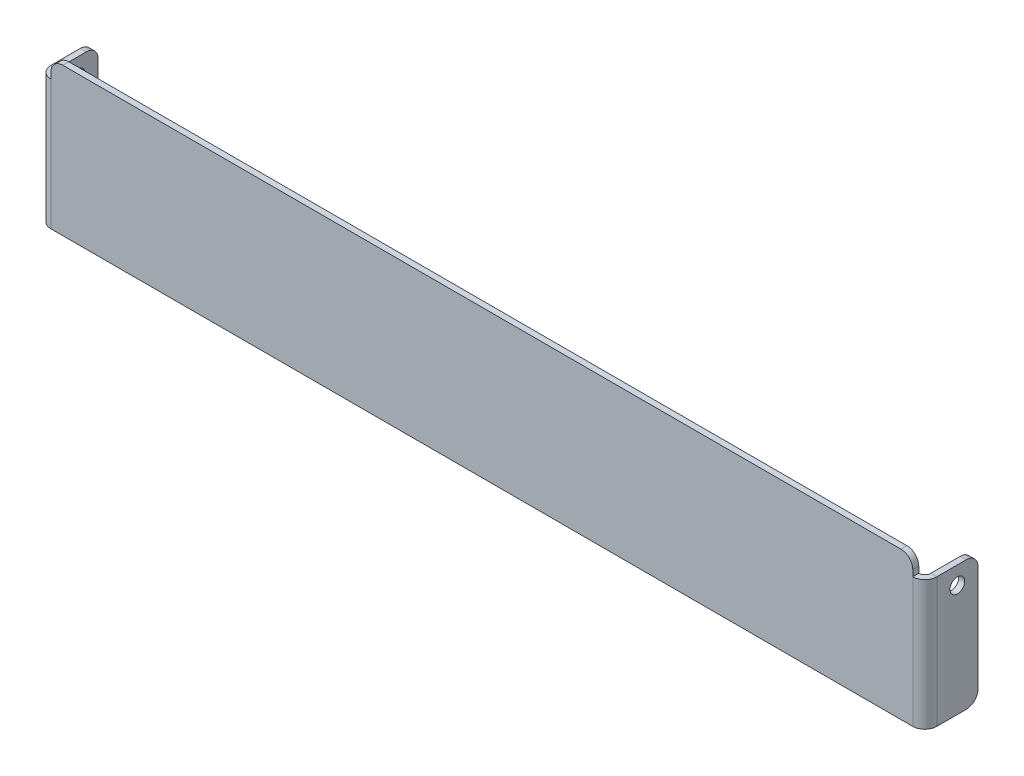
ISO-10303-21;
HEADER;
FILE_DESCRIPTION(('STEP AP214'),'2;1');
FILE_NAME('part.step','',(''),(''),'','','');
FILE_SCHEMA(('AUTOMOTIVE_DESIGN { 1 0 10303 214 1 1 1 1 }'));
ENDSEC;
DATA;
#1=APPLICATION_CONTEXT('core data for automotive mechanical design processes');
#2=APPLICATION_PROTOCOL_DEFINITION('international standard','automotive_design',2000,#1);
#3=PRODUCT_CONTEXT('',#1,'mechanical');
#4=PRODUCT('Part','Part','',(#3));
#5=PRODUCT_RELATED_PRODUCT_CATEGORY('part','',(#4));
#6=PRODUCT_DEFINITION_FORMATION('','',#4);
#7=PRODUCT_DEFINITION_CONTEXT('part definition',#1,'design');
#8=PRODUCT_DEFINITION('design','',#6,#7);
#9=PRODUCT_DEFINITION_SHAPE('','',#8);
#10=(LENGTH_UNIT() NAMED_UNIT(*) SI_UNIT(.MILLI.,.METRE.));
#11=(NAMED_UNIT(*) PLANE_ANGLE_UNIT() SI_UNIT($,.RADIAN.));
#12=(NAMED_UNIT(*) SI_UNIT($,.STERADIAN.) SOLID_ANGLE_UNIT());
#13=UNCERTAINTY_MEASURE_WITH_UNIT(LENGTH_MEASURE(1.E-05),#10,'distance_accuracy_value','');
#14=(GEOMETRIC_REPRESENTATION_CONTEXT(3) GLOBAL_UNCERTAINTY_ASSIGNED_CONTEXT((#13)) GLOBAL_UNIT_ASSIGNED_CONTEXT((#10,
#11,#12)) REPRESENTATION_CONTEXT('',''));
#15=CARTESIAN_POINT('',(0.,0.,0.));
#16=DIRECTION('',(0.,0.,1.));
#17=DIRECTION('',(1.,0.,0.));
#18=AXIS2_PLACEMENT_3D('',#15,#16,#17);
#19=CARTESIAN_POINT('',(-72.968,-24.9959999999984,-1.016));
#20=DIRECTION('',(-1.,0.,0.));
#21=DIRECTION('',(0.,0.,1.));
#22=AXIS2_PLACEMENT_3D('',#19,#20,#21);
#23=PLANE('',#22);
#24=DIRECTION('',(0.,-1.,0.));
#25=VECTOR('',#24,1.);
#26=CARTESIAN_POINT('',(-72.968,-24.9959999999984,0.));
#27=LINE('',#26,#25);
#28=CARTESIAN_POINT('',(-72.968,-2.,0.));
#29=VERTEX_POINT('',#28);
#30=CARTESIAN_POINT('',(-72.968,-3.048,0.));
#31=VERTEX_POINT('',#30);
#32=EDGE_CURVE('E342',#29,#31,#27,.T.);
#33=ORIENTED_EDGE('',*,*,#32,.F.);
#34=DIRECTION('',(0.,0.,1.));
#35=VECTOR('',#34,1.);
#36=CARTESIAN_POINT('',(-72.968,-2.,-1.016));
#37=LINE('',#36,#35);
#38=CARTESIAN_POINT('',(-72.968,-2.,-1.016));
#39=VERTEX_POINT('',#38);
#40=EDGE_CURVE('E68',#29,#39,#37,.F.);
#41=ORIENTED_EDGE('',*,*,#40,.T.);
#42=DIRECTION('',(0.,-1.,0.));
#43=VECTOR('',#42,1.);
#44=CARTESIAN_POINT('',(-72.968,-24.9959999999984,-1.016));
#45=LINE('',#44,#43);
#46=CARTESIAN_POINT('',(-72.968,-3.048,-1.01599999999999));
#47=VERTEX_POINT('',#46);
#48=EDGE_CURVE('E343',#39,#47,#45,.T.);
#49=ORIENTED_EDGE('',*,*,#48,.T.);
#50=DIRECTION('',(0.,0.,1.));
#51=VECTOR('',#50,1.);
#52=CARTESIAN_POINT('',(-72.968,-3.048,-1.01599999999999));
#53=LINE('',#52,#51);
#54=EDGE_CURVE('E330',#47,#31,#53,.T.);
#55=ORIENTED_EDGE('',*,*,#54,.T.);
#56=EDGE_LOOP('',(#33,#41,#49,#55));
#57=FACE_BOUND('',#56,.T.);
#58=ADVANCED_FACE('F59',(#57),#23,.T.);
#59=CARTESIAN_POINT('',(-72.968,0.,-1.016));
#60=DIRECTION('',(0.,1.,0.));
#61=DIRECTION('',(0.,0.,1.));
#62=AXIS2_PLACEMENT_3D('',#59,#60,#61);
#63=PLANE('',#62);
#64=DIRECTION('',(-1.,0.,0.));
#65=VECTOR('',#64,1.);
#66=CARTESIAN_POINT('',(-72.968,0.,-1.016));
#67=LINE('',#66,#65);
#68=CARTESIAN_POINT('',(70.968,0.,-1.016));
#69=VERTEX_POINT('',#68);
#70=CARTESIAN_POINT('',(-70.968,0.,-1.016));
#71=VERTEX_POINT('',#70);
#72=EDGE_CURVE('E348',#69,#71,#67,.T.);
#73=ORIENTED_EDGE('',*,*,#72,.T.);
#74=DIRECTION('',(0.,0.,1.));
#75=VECTOR('',#74,1.);
#76=CARTESIAN_POINT('',(-70.968,0.,-1.016));
#77=LINE('',#76,#75);
#78=CARTESIAN_POINT('',(-70.968,0.,0.));
#79=VERTEX_POINT('',#78);
#80=EDGE_CURVE('E375',#71,#79,#77,.T.);
#81=ORIENTED_EDGE('',*,*,#80,.T.);
#82=DIRECTION('',(-1.,0.,0.));
#83=VECTOR('',#82,1.);
#84=CARTESIAN_POINT('',(-72.968,0.,0.));
#85=LINE('',#84,#83);
#86=CARTESIAN_POINT('',(70.968,0.,0.));
#87=VERTEX_POINT('',#86);
#88=EDGE_CURVE('E346',#87,#79,#85,.T.);
#89=ORIENTED_EDGE('',*,*,#88,.F.);
#90=DIRECTION('',(0.,0.,1.));
#91=VECTOR('',#90,1.);
#92=CARTESIAN_POINT('',(70.968,0.,-1.016));
#93=LINE('',#92,#91);
#94=EDGE_CURVE('E276',#69,#87,#93,.T.);
#95=ORIENTED_EDGE('',*,*,#94,.F.);
#96=EDGE_LOOP('',(#73,#81,#89,#95));
#97=FACE_BOUND('',#96,.T.);
#98=ADVANCED_FACE('F381',(#97),#63,.T.);
#99=CARTESIAN_POINT('',(-72.968,-24.9959999999984,-1.016));
#100=DIRECTION('',(0.,-1.,0.));
#101=DIRECTION('',(0.,0.,-1.));
#102=AXIS2_PLACEMENT_3D('',#99,#100,#101);
#103=PLANE('',#102);
#104=DIRECTION('',(1.,0.,0.));
#105=VECTOR('',#104,1.);
#106=CARTESIAN_POINT('',(-72.968,-24.9959999999984,0.));
#107=LINE('',#106,#105);
#108=CARTESIAN_POINT('',(-72.968,-24.9959999999984,0.));
#109=VERTEX_POINT('',#108);
#110=CARTESIAN_POINT('',(72.968,-24.9959999999984,0.));
#111=VERTEX_POINT('',#110);
#112=EDGE_CURVE('E353',#109,#111,#107,.T.);
#113=ORIENTED_EDGE('',*,*,#112,.F.);
#114=DIRECTION('',(0.,0.,1.));
#115=VECTOR('',#114,1.);
#116=CARTESIAN_POINT('',(-72.968,-24.9959999999984,-1.016));
#117=LINE('',#116,#115);
#118=CARTESIAN_POINT('',(-72.968,-24.9959999999984,-1.01599999999999));
#119=VERTEX_POINT('',#118);
#120=EDGE_CURVE('E351',#119,#109,#117,.T.);
#121=ORIENTED_EDGE('',*,*,#120,.F.);
#122=DIRECTION('',(1.,0.,0.));
#123=VECTOR('',#122,1.);
#124=CARTESIAN_POINT('',(-72.968,-24.9959999999984,-1.016));
#125=LINE('',#124,#123);
#126=CARTESIAN_POINT('',(72.968,-24.9959999999984,-1.01599999999999));
#127=VERTEX_POINT('',#126);
#128=EDGE_CURVE('E345',#119,#127,#125,.T.);
#129=ORIENTED_EDGE('',*,*,#128,.T.);
#130=DIRECTION('',(0.,0.,1.));
#131=VECTOR('',#130,1.);
#132=CARTESIAN_POINT('',(72.968,-24.9959999999984,-1.016));
#133=LINE('',#132,#131);
#134=EDGE_CURVE('E255',#127,#111,#133,.T.);
#135=ORIENTED_EDGE('',*,*,#134,.T.);
#136=EDGE_LOOP('',(#113,#121,#129,#135));
#137=FACE_BOUND('',#136,.T.);
#138=ADVANCED_FACE('F412',(#137),#103,.T.);
#139=CARTESIAN_POINT('',(0.,0.,-1.016));
#140=DIRECTION('',(0.,0.,-1.));
#141=DIRECTION('',(-1.,0.,0.));
#142=AXIS2_PLACEMENT_3D('',#139,#140,#141);
#143=PLANE('',#142);
#144=ORIENTED_EDGE('',*,*,#48,.F.);
#145=CARTESIAN_POINT('',(-70.968,-2.,-1.016));
#146=DIRECTION('',(0.,0.,-1.));
#147=DIRECTION('',(-1.,0.,0.));
#148=AXIS2_PLACEMENT_3D('',#145,#146,#147);
#149=CIRCLE('',#148,2.);
#150=EDGE_CURVE('E13',#39,#71,#149,.T.);
#151=ORIENTED_EDGE('',*,*,#150,.T.);
#152=ORIENTED_EDGE('',*,*,#72,.F.);
#153=CARTESIAN_POINT('',(70.968,-2.,-1.016));
#154=DIRECTION('',(0.,0.,1.));
#155=DIRECTION('',(1.,0.,0.));
#156=AXIS2_PLACEMENT_3D('',#153,#154,#155);
#157=CIRCLE('',#156,2.);
#158=CARTESIAN_POINT('',(72.968,-2.,-1.016));
#159=VERTEX_POINT('',#158);
#160=EDGE_CURVE('E284',#159,#69,#157,.T.);
#161=ORIENTED_EDGE('',*,*,#160,.F.);
#162=DIRECTION('',(0.,-1.,0.));
#163=VECTOR('',#162,1.);
#164=CARTESIAN_POINT('',(72.968,-24.9959999999984,-1.016));
#165=LINE('',#164,#163);
#166=CARTESIAN_POINT('',(72.968,-3.048,-1.01599999999999));
#167=VERTEX_POINT('',#166);
#168=EDGE_CURVE('E252',#159,#167,#165,.T.);
#169=ORIENTED_EDGE('',*,*,#168,.T.);
#170=DIRECTION('',(0.,1.,0.));
#171=VECTOR('',#170,1.);
#172=CARTESIAN_POINT('',(72.968,-3.048,-1.01599999999999));
#173=LINE('',#172,#171);
#174=EDGE_CURVE('E241',#167,#127,#173,.F.);
#175=ORIENTED_EDGE('',*,*,#174,.T.);
#176=ORIENTED_EDGE('',*,*,#128,.F.);
#177=DIRECTION('',(0.,1.,0.));
#178=VECTOR('',#177,1.);
#179=CARTESIAN_POINT('',(-72.968,-3.048,-1.01599999999999));
#180=LINE('',#179,#178);
#181=EDGE_CURVE('E336',#47,#119,#180,.F.);
#182=ORIENTED_EDGE('',*,*,#181,.F.);
#183=EDGE_LOOP('',(#144,#151,#152,#161,#169,#175,#176,#182));
#184=FACE_BOUND('',#183,.T.);
#185=ADVANCED_FACE('F393',(#184),#143,.T.);
#186=CARTESIAN_POINT('',(0.,0.,0.));
#187=DIRECTION('',(0.,0.,-1.));
#188=DIRECTION('',(-1.,0.,0.));
#189=AXIS2_PLACEMENT_3D('',#186,#187,#188);
#190=PLANE('',#189);
#191=ORIENTED_EDGE('',*,*,#88,.T.);
#192=CARTESIAN_POINT('',(-70.968,-2.,0.));
#193=DIRECTION('',(0.,0.,-1.));
#194=DIRECTION('',(-1.,0.,0.));
#195=AXIS2_PLACEMENT_3D('',#192,#193,#194);
#196=CIRCLE('',#195,2.);
#197=EDGE_CURVE('E82',#79,#29,#196,.F.);
#198=ORIENTED_EDGE('',*,*,#197,.T.);
#199=ORIENTED_EDGE('',*,*,#32,.T.);
#200=DIRECTION('',(0.,1.,0.));
#201=VECTOR('',#200,1.);
#202=CARTESIAN_POINT('',(-72.968,-3.048,0.));
#203=LINE('',#202,#201);
#204=EDGE_CURVE('E323',#31,#109,#203,.F.);
#205=ORIENTED_EDGE('',*,*,#204,.T.);
#206=ORIENTED_EDGE('',*,*,#112,.T.);
#207=DIRECTION('',(0.,1.,0.));
#208=VECTOR('',#207,1.);
#209=CARTESIAN_POINT('',(72.968,-3.048,0.));
#210=LINE('',#209,#208);
#211=CARTESIAN_POINT('',(72.968,-3.048,0.));
#212=VERTEX_POINT('',#211);
#213=EDGE_CURVE('E236',#212,#111,#210,.F.);
#214=ORIENTED_EDGE('',*,*,#213,.F.);
#215=DIRECTION('',(0.,-1.,0.));
#216=VECTOR('',#215,1.);
#217=CARTESIAN_POINT('',(72.968,-24.9959999999984,0.));
#218=LINE('',#217,#216);
#219=CARTESIAN_POINT('',(72.968,-2.,0.));
#220=VERTEX_POINT('',#219);
#221=EDGE_CURVE('E251',#220,#212,#218,.T.);
#222=ORIENTED_EDGE('',*,*,#221,.F.);
#223=CARTESIAN_POINT('',(70.968,-2.,0.));
#224=DIRECTION('',(0.,0.,1.));
#225=DIRECTION('',(1.,0.,0.));
#226=AXIS2_PLACEMENT_3D('',#223,#224,#225);
#227=CIRCLE('',#226,2.);
#228=EDGE_CURVE('E279',#87,#220,#227,.F.);
#229=ORIENTED_EDGE('',*,*,#228,.F.);
#230=EDGE_LOOP('',(#191,#198,#199,#205,#206,#214,#222,#229));
#231=FACE_BOUND('',#230,.T.);
#232=ADVANCED_FACE('F386',(#231),#190,.F.);
#233=CARTESIAN_POINT('',(-72.968,-24.9959999999984,-2.03200000000001));
#234=DIRECTION('',(0.,-1.,0.));
#235=DIRECTION('',(0.,0.,-1.));
#236=AXIS2_PLACEMENT_3D('',#233,#234,#235);
#237=PLANE('',#236);
#238=DIRECTION('',(1.,0.,0.));
#239=VECTOR('',#238,1.);
#240=CARTESIAN_POINT('',(-75.,-24.9959999999984,-2.032));
#241=LINE('',#240,#239);
#242=CARTESIAN_POINT('',(-73.984,-24.9959999999984,-2.03200000000001));
#243=VERTEX_POINT('',#242);
#244=CARTESIAN_POINT('',(-75.,-24.9959999999984,-2.032));
#245=VERTEX_POINT('',#244);
#246=EDGE_CURVE('E320',#243,#245,#241,.F.);
#247=ORIENTED_EDGE('',*,*,#246,.F.);
#248=CARTESIAN_POINT('',(-72.968,-24.9959999999984,-2.03200000000001));
#249=DIRECTION('',(0.,1.,0.));
#250=DIRECTION('',(0.,0.,1.));
#251=AXIS2_PLACEMENT_3D('',#248,#249,#250);
#252=CIRCLE('',#251,1.01600000000002);
#253=EDGE_CURVE('E333',#119,#243,#252,.F.);
#254=ORIENTED_EDGE('',*,*,#253,.F.);
#255=ORIENTED_EDGE('',*,*,#120,.T.);
#256=CARTESIAN_POINT('',(-72.968,-24.9959999999984,-2.03200000000001));
#257=DIRECTION('',(0.,1.,0.));
#258=DIRECTION('',(0.,0.,1.));
#259=AXIS2_PLACEMENT_3D('',#256,#257,#258);
#260=CIRCLE('',#259,2.03200000000002);
#261=EDGE_CURVE('E326',#109,#245,#260,.F.);
#262=ORIENTED_EDGE('',*,*,#261,.T.);
#263=EDGE_LOOP('',(#247,#254,#255,#262));
#264=FACE_BOUND('',#263,.T.);
#265=ADVANCED_FACE('F439',(#264),#237,.T.);
#266=CARTESIAN_POINT('',(-72.968,-3.048,-2.03200000000001));
#267=DIRECTION('',(0.,-1.,0.));
#268=DIRECTION('',(0.,0.,-1.));
#269=AXIS2_PLACEMENT_3D('',#266,#267,#268);
#270=PLANE('',#269);
#271=CARTESIAN_POINT('',(-72.968,-3.048,-2.03200000000001));
#272=DIRECTION('',(0.,1.,0.));
#273=DIRECTION('',(0.,0.,1.));
#274=AXIS2_PLACEMENT_3D('',#271,#272,#273);
#275=CIRCLE('',#274,1.01600000000002);
#276=CARTESIAN_POINT('',(-73.984,-3.048,-2.03200000000001));
#277=VERTEX_POINT('',#276);
#278=EDGE_CURVE('E297',#277,#47,#275,.T.);
#279=ORIENTED_EDGE('',*,*,#278,.F.);
#280=DIRECTION('',(1.,0.,0.));
#281=VECTOR('',#280,1.);
#282=CARTESIAN_POINT('',(-73.984,-3.048,-2.03200000000001));
#283=LINE('',#282,#281);
#284=CARTESIAN_POINT('',(-75.,-3.048,-2.032));
#285=VERTEX_POINT('',#284);
#286=EDGE_CURVE('E315',#277,#285,#283,.F.);
#287=ORIENTED_EDGE('',*,*,#286,.T.);
#288=CARTESIAN_POINT('',(-72.968,-3.048,-2.03200000000001));
#289=DIRECTION('',(0.,1.,0.));
#290=DIRECTION('',(0.,0.,1.));
#291=AXIS2_PLACEMENT_3D('',#288,#289,#290);
#292=CIRCLE('',#291,2.03200000000002);
#293=EDGE_CURVE('E327',#285,#31,#292,.T.);
#294=ORIENTED_EDGE('',*,*,#293,.T.);
#295=ORIENTED_EDGE('',*,*,#54,.F.);
#296=EDGE_LOOP('',(#279,#287,#294,#295));
#297=FACE_BOUND('',#296,.T.);
#298=ADVANCED_FACE('F455',(#297),#270,.F.);
#299=CARTESIAN_POINT('',(-72.968,-3.048,-2.03200000000001));
#300=DIRECTION('',(0.,1.,0.));
#301=DIRECTION('',(-1.,0.,0.));
#302=AXIS2_PLACEMENT_3D('',#299,#300,#301);
#303=CYLINDRICAL_SURFACE('',#302,2.03200000000002);
#304=ORIENTED_EDGE('',*,*,#204,.F.);
#305=ORIENTED_EDGE('',*,*,#293,.F.);
#306=DIRECTION('',(0.,1.,0.));
#307=VECTOR('',#306,1.);
#308=CARTESIAN_POINT('',(-75.,0.,-2.032));
#309=LINE('',#308,#307);
#310=EDGE_CURVE('E312',#245,#285,#309,.T.);
#311=ORIENTED_EDGE('',*,*,#310,.F.);
#312=ORIENTED_EDGE('',*,*,#261,.F.);
#313=EDGE_LOOP('',(#304,#305,#311,#312));
#314=FACE_BOUND('',#313,.T.);
#315=ADVANCED_FACE('F460',(#314),#303,.T.);
#316=CARTESIAN_POINT('',(-72.968,-3.048,-2.03200000000001));
#317=DIRECTION('',(0.,1.,0.));
#318=DIRECTION('',(-1.,0.,0.));
#319=AXIS2_PLACEMENT_3D('',#316,#317,#318);
#320=CYLINDRICAL_SURFACE('',#319,1.01600000000002);
#321=ORIENTED_EDGE('',*,*,#181,.T.);
#322=ORIENTED_EDGE('',*,*,#253,.T.);
#323=DIRECTION('',(0.,-1.,0.));
#324=VECTOR('',#323,1.);
#325=CARTESIAN_POINT('',(-73.984,-24.9959999999984,-2.03200000000001));
#326=LINE('',#325,#324);
#327=EDGE_CURVE('E318',#243,#277,#326,.F.);
#328=ORIENTED_EDGE('',*,*,#327,.T.);
#329=ORIENTED_EDGE('',*,*,#278,.T.);
#330=EDGE_LOOP('',(#321,#322,#328,#329));
#331=FACE_BOUND('',#330,.T.);
#332=ADVANCED_FACE('F444',(#331),#320,.F.);
#333=CARTESIAN_POINT('',(-75.,-3.048,-1.016));
#334=DIRECTION('',(0.,-1.,0.));
#335=DIRECTION('',(0.,0.,-1.));
#336=AXIS2_PLACEMENT_3D('',#333,#334,#335);
#337=PLANE('',#336);
#338=DIRECTION('',(0.,0.,-1.));
#339=VECTOR('',#338,1.);
#340=CARTESIAN_POINT('',(-73.984,-3.048,-1.016));
#341=LINE('',#340,#339);
#342=CARTESIAN_POINT('',(-73.984,-3.048,-7.016));
#343=VERTEX_POINT('',#342);
#344=EDGE_CURVE('E309',#277,#343,#341,.T.);
#345=ORIENTED_EDGE('',*,*,#344,.T.);
#346=DIRECTION('',(1.,0.,0.));
#347=VECTOR('',#346,1.);
#348=CARTESIAN_POINT('',(-75.,-3.048,-7.01599999999999));
#349=LINE('',#348,#347);
#350=CARTESIAN_POINT('',(-75.,-3.048,-7.01599999999999));
#351=VERTEX_POINT('',#350);
#352=EDGE_CURVE('E373',#343,#351,#349,.F.);
#353=ORIENTED_EDGE('',*,*,#352,.T.);
#354=DIRECTION('',(0.,0.,1.));
#355=VECTOR('',#354,1.);
#356=CARTESIAN_POINT('',(-75.,-3.048,2.56705950230416E-13));
#357=LINE('',#356,#355);
#358=EDGE_CURVE('E301',#285,#351,#357,.F.);
#359=ORIENTED_EDGE('',*,*,#358,.F.);
#360=ORIENTED_EDGE('',*,*,#286,.F.);
#361=EDGE_LOOP('',(#345,#353,#359,#360));
#362=FACE_BOUND('',#361,.T.);
#363=ADVANCED_FACE('F453',(#362),#337,.F.);
#364=CARTESIAN_POINT('',(-75.,-24.9959999999984,-9.01599999999999));
#365=DIRECTION('',(0.,1.,0.));
#366=DIRECTION('',(0.,0.,1.));
#367=AXIS2_PLACEMENT_3D('',#364,#365,#366);
#368=PLANE('',#367);
#369=DIRECTION('',(0.,0.,-1.));
#370=VECTOR('',#369,1.);
#371=CARTESIAN_POINT('',(-75.,-24.9959999999984,2.56705950230416E-13));
#372=LINE('',#371,#370);
#373=CARTESIAN_POINT('',(-75.,-24.9959999999984,-7.01599999999999));
#374=VERTEX_POINT('',#373);
#375=EDGE_CURVE('E295',#374,#245,#372,.F.);
#376=ORIENTED_EDGE('',*,*,#375,.F.);
#377=DIRECTION('',(1.,0.,0.));
#378=VECTOR('',#377,1.);
#379=CARTESIAN_POINT('',(-75.,-24.9959999999984,-7.01599999999999));
#380=LINE('',#379,#378);
#381=CARTESIAN_POINT('',(-73.984,-24.9959999999984,-7.01599999999999));
#382=VERTEX_POINT('',#381);
#383=EDGE_CURVE('E357',#374,#382,#380,.T.);
#384=ORIENTED_EDGE('',*,*,#383,.T.);
#385=DIRECTION('',(0.,0.,1.));
#386=VECTOR('',#385,1.);
#387=CARTESIAN_POINT('',(-73.984,-24.9959999999984,-9.01599999999999));
#388=LINE('',#387,#386);
#389=EDGE_CURVE('E304',#382,#243,#388,.T.);
#390=ORIENTED_EDGE('',*,*,#389,.T.);
#391=ORIENTED_EDGE('',*,*,#246,.T.);
#392=EDGE_LOOP('',(#376,#384,#390,#391));
#393=FACE_BOUND('',#392,.T.);
#394=ADVANCED_FACE('F434',(#393),#368,.F.);
#395=CARTESIAN_POINT('',(-75.,0.,2.56705950230416E-13));
#396=DIRECTION('',(-1.,0.,0.));
#397=DIRECTION('',(0.,0.,1.));
#398=AXIS2_PLACEMENT_3D('',#395,#396,#397);
#399=PLANE('',#398);
#400=CARTESIAN_POINT('',(-75.,-6.048,-5.524));
#401=DIRECTION('',(-1.,0.,0.));
#402=DIRECTION('',(0.,0.,1.));
#403=AXIS2_PLACEMENT_3D('',#400,#401,#402);
#404=CIRCLE('',#403,1.25);
#405=CARTESIAN_POINT('',(-75.,-6.048,-4.274));
#406=VERTEX_POINT('',#405);
#407=EDGE_CURVE('E287',#406,#406,#404,.T.);
#408=ORIENTED_EDGE('',*,*,#407,.F.);
#409=EDGE_LOOP('',(#408));
#410=FACE_BOUND('',#409,.T.);
#411=DIRECTION('',(0.,1.,0.));
#412=VECTOR('',#411,1.);
#413=CARTESIAN_POINT('',(-75.,0.,-9.01599999999999));
#414=LINE('',#413,#412);
#415=CARTESIAN_POINT('',(-75.,-5.048,-9.01599999999999));
#416=VERTEX_POINT('',#415);
#417=CARTESIAN_POINT('',(-75.,-22.9959999999984,-9.01599999999999));
#418=VERTEX_POINT('',#417);
#419=EDGE_CURVE('E298',#416,#418,#414,.F.);
#420=ORIENTED_EDGE('',*,*,#419,.T.);
#421=CARTESIAN_POINT('',(-75.,-22.9959999999984,-7.01599999999999));
#422=DIRECTION('',(-1.,0.,0.));
#423=DIRECTION('',(0.,0.,1.));
#424=AXIS2_PLACEMENT_3D('',#421,#422,#423);
#425=CIRCLE('',#424,2.);
#426=EDGE_CURVE('E371',#418,#374,#425,.T.);
#427=ORIENTED_EDGE('',*,*,#426,.T.);
#428=ORIENTED_EDGE('',*,*,#375,.T.);
#429=ORIENTED_EDGE('',*,*,#310,.T.);
#430=ORIENTED_EDGE('',*,*,#358,.T.);
#431=CARTESIAN_POINT('',(-75.,-5.048,-7.01599999999999));
#432=DIRECTION('',(-1.,0.,0.));
#433=DIRECTION('',(0.,0.,1.));
#434=AXIS2_PLACEMENT_3D('',#431,#432,#433);
#435=CIRCLE('',#434,2.);
#436=EDGE_CURVE('E369',#351,#416,#435,.T.);
#437=ORIENTED_EDGE('',*,*,#436,.T.);
#438=EDGE_LOOP('',(#420,#427,#428,#429,#430,#437));
#439=FACE_BOUND('',#438,.T.);
#440=ADVANCED_FACE('F430',(#410,#439),#399,.T.);
#441=CARTESIAN_POINT('',(-73.984,0.,2.53158605190152E-13));
#442=DIRECTION('',(-1.,0.,0.));
#443=DIRECTION('',(0.,0.,1.));
#444=AXIS2_PLACEMENT_3D('',#441,#442,#443);
#445=PLANE('',#444);
#446=CARTESIAN_POINT('',(-73.984,-6.048,-5.524));
#447=DIRECTION('',(-1.,0.,0.));
#448=DIRECTION('',(0.,0.,1.));
#449=AXIS2_PLACEMENT_3D('',#446,#447,#448);
#450=CIRCLE('',#449,1.24999999999999);
#451=CARTESIAN_POINT('',(-73.984,-6.048,-4.27400000000001));
#452=VERTEX_POINT('',#451);
#453=EDGE_CURVE('E63',#452,#452,#450,.T.);
#454=ORIENTED_EDGE('',*,*,#453,.T.);
#455=EDGE_LOOP('',(#454));
#456=FACE_BOUND('',#455,.T.);
#457=ORIENTED_EDGE('',*,*,#389,.F.);
#458=CARTESIAN_POINT('',(-73.984,-22.9959999999984,-7.01599999999999));
#459=DIRECTION('',(-1.,0.,0.));
#460=DIRECTION('',(0.,0.,1.));
#461=AXIS2_PLACEMENT_3D('',#458,#459,#460);
#462=CIRCLE('',#461,2.);
#463=CARTESIAN_POINT('',(-73.984,-22.9959999999984,-9.01599999999999));
#464=VERTEX_POINT('',#463);
#465=EDGE_CURVE('E362',#382,#464,#462,.F.);
#466=ORIENTED_EDGE('',*,*,#465,.T.);
#467=DIRECTION('',(0.,-1.,0.));
#468=VECTOR('',#467,1.);
#469=CARTESIAN_POINT('',(-73.984,-3.048,-9.016));
#470=LINE('',#469,#468);
#471=CARTESIAN_POINT('',(-73.984,-5.048,-9.016));
#472=VERTEX_POINT('',#471);
#473=EDGE_CURVE('E306',#472,#464,#470,.T.);
#474=ORIENTED_EDGE('',*,*,#473,.F.);
#475=CARTESIAN_POINT('',(-73.984,-5.048,-7.016));
#476=DIRECTION('',(-1.,0.,0.));
#477=DIRECTION('',(0.,0.,1.));
#478=AXIS2_PLACEMENT_3D('',#475,#476,#477);
#479=CIRCLE('',#478,2.);
#480=EDGE_CURVE('E360',#472,#343,#479,.F.);
#481=ORIENTED_EDGE('',*,*,#480,.T.);
#482=ORIENTED_EDGE('',*,*,#344,.F.);
#483=ORIENTED_EDGE('',*,*,#327,.F.);
#484=EDGE_LOOP('',(#457,#466,#474,#481,#482,#483));
#485=FACE_BOUND('',#484,.T.);
#486=ADVANCED_FACE('F422',(#456,#485),#445,.F.);
#487=CARTESIAN_POINT('',(-75.,-3.048,-9.01599999999999));
#488=DIRECTION('',(0.,0.,1.));
#489=DIRECTION('',(1.,0.,0.));
#490=AXIS2_PLACEMENT_3D('',#487,#488,#489);
#491=PLANE('',#490);
#492=ORIENTED_EDGE('',*,*,#473,.T.);
#493=DIRECTION('',(1.,0.,0.));
#494=VECTOR('',#493,1.);
#495=CARTESIAN_POINT('',(-75.,-22.9959999999984,-9.01599999999999));
#496=LINE('',#495,#494);
#497=EDGE_CURVE('E367',#464,#418,#496,.F.);
#498=ORIENTED_EDGE('',*,*,#497,.T.);
#499=ORIENTED_EDGE('',*,*,#419,.F.);
#500=DIRECTION('',(1.,0.,0.));
#501=VECTOR('',#500,1.);
#502=CARTESIAN_POINT('',(-75.,-5.048,-9.01599999999999));
#503=LINE('',#502,#501);
#504=EDGE_CURVE('E364',#416,#472,#503,.T.);
#505=ORIENTED_EDGE('',*,*,#504,.T.);
#506=EDGE_LOOP('',(#492,#498,#499,#505));
#507=FACE_BOUND('',#506,.T.);
#508=ADVANCED_FACE('F417',(#507),#491,.F.);
#509=CARTESIAN_POINT('',(-75.,-22.9959999999984,-7.01599999999999));
#510=DIRECTION('',(1.,0.,0.));
#511=DIRECTION('',(0.,0.,-1.));
#512=AXIS2_PLACEMENT_3D('',#509,#510,#511);
#513=CYLINDRICAL_SURFACE('',#512,2.);
#514=ORIENTED_EDGE('',*,*,#426,.F.);
#515=ORIENTED_EDGE('',*,*,#497,.F.);
#516=ORIENTED_EDGE('',*,*,#465,.F.);
#517=ORIENTED_EDGE('',*,*,#383,.F.);
#518=EDGE_LOOP('',(#514,#515,#516,#517));
#519=FACE_BOUND('',#518,.T.);
#520=ADVANCED_FACE('F405',(#519),#513,.T.);
#521=CARTESIAN_POINT('',(-75.,-5.048,-7.01599999999999));
#522=DIRECTION('',(1.,0.,0.));
#523=DIRECTION('',(0.,0.,-1.));
#524=AXIS2_PLACEMENT_3D('',#521,#522,#523);
#525=CYLINDRICAL_SURFACE('',#524,2.);
#526=ORIENTED_EDGE('',*,*,#436,.F.);
#527=ORIENTED_EDGE('',*,*,#352,.F.);
#528=ORIENTED_EDGE('',*,*,#480,.F.);
#529=ORIENTED_EDGE('',*,*,#504,.F.);
#530=EDGE_LOOP('',(#526,#527,#528,#529));
#531=FACE_BOUND('',#530,.T.);
#532=ADVANCED_FACE('F397',(#531),#525,.T.);
#533=CARTESIAN_POINT('',(-70.968,-2.,-1.016));
#534=DIRECTION('',(0.,0.,1.));
#535=DIRECTION('',(1.,0.,0.));
#536=AXIS2_PLACEMENT_3D('',#533,#534,#535);
#537=CYLINDRICAL_SURFACE('',#536,2.);
#538=ORIENTED_EDGE('',*,*,#150,.F.);
#539=ORIENTED_EDGE('',*,*,#40,.F.);
#540=ORIENTED_EDGE('',*,*,#197,.F.);
#541=ORIENTED_EDGE('',*,*,#80,.F.);
#542=EDGE_LOOP('',(#538,#539,#540,#541));
#543=FACE_BOUND('',#542,.T.);
#544=ADVANCED_FACE('F61',(#543),#537,.T.);
#545=CARTESIAN_POINT('',(-75.,-6.048,-5.524));
#546=DIRECTION('',(-1.,0.,0.));
#547=DIRECTION('',(0.,0.,1.));
#548=AXIS2_PLACEMENT_3D('',#545,#546,#547);
#549=CYLINDRICAL_SURFACE('',#548,1.24999999999999);
#550=ORIENTED_EDGE('',*,*,#407,.T.);
#551=EDGE_LOOP('',(#550));
#552=FACE_BOUND('',#551,.T.);
#553=ORIENTED_EDGE('',*,*,#453,.F.);
#554=EDGE_LOOP('',(#553));
#555=FACE_BOUND('',#554,.T.);
#556=ADVANCED_FACE('F396',(#552,#555),#549,.F.);
#557=CARTESIAN_POINT('',(72.968,-24.9959999999984,-1.016));
#558=DIRECTION('',(1.,0.,0.));
#559=DIRECTION('',(0.,0.,1.));
#560=AXIS2_PLACEMENT_3D('',#557,#558,#559);
#561=PLANE('',#560);
#562=ORIENTED_EDGE('',*,*,#221,.T.);
#563=DIRECTION('',(0.,0.,1.));
#564=VECTOR('',#563,1.);
#565=CARTESIAN_POINT('',(72.968,-3.048,-1.01599999999999));
#566=LINE('',#565,#564);
#567=EDGE_CURVE('E234',#167,#212,#566,.T.);
#568=ORIENTED_EDGE('',*,*,#567,.F.);
#569=ORIENTED_EDGE('',*,*,#168,.F.);
#570=DIRECTION('',(0.,0.,1.));
#571=VECTOR('',#570,1.);
#572=CARTESIAN_POINT('',(72.968,-2.,-1.016));
#573=LINE('',#572,#571);
#574=EDGE_CURVE('E281',#220,#159,#573,.F.);
#575=ORIENTED_EDGE('',*,*,#574,.F.);
#576=EDGE_LOOP('',(#562,#568,#569,#575));
#577=FACE_BOUND('',#576,.T.);
#578=ADVANCED_FACE('F402',(#577),#561,.T.);
#579=CARTESIAN_POINT('',(72.968,-24.9959999999984,-2.03200000000001));
#580=DIRECTION('',(0.,-1.,0.));
#581=DIRECTION('',(0.,0.,-1.));
#582=AXIS2_PLACEMENT_3D('',#579,#580,#581);
#583=PLANE('',#582);
#584=DIRECTION('',(-1.,0.,0.));
#585=VECTOR('',#584,1.);
#586=CARTESIAN_POINT('',(75.,-24.9959999999984,-2.032));
#587=LINE('',#586,#585);
#588=CARTESIAN_POINT('',(73.984,-24.9959999999984,-2.03200000000001));
#589=VERTEX_POINT('',#588);
#590=CARTESIAN_POINT('',(75.,-24.9959999999984,-2.032));
#591=VERTEX_POINT('',#590);
#592=EDGE_CURVE('E291',#589,#591,#587,.F.);
#593=ORIENTED_EDGE('',*,*,#592,.T.);
#594=CARTESIAN_POINT('',(72.968,-24.9959999999984,-2.03200000000001));
#595=DIRECTION('',(0.,-1.,0.));
#596=DIRECTION('',(0.,0.,1.));
#597=AXIS2_PLACEMENT_3D('',#594,#595,#596);
#598=CIRCLE('',#597,2.03200000000002);
#599=EDGE_CURVE('E218',#111,#591,#598,.F.);
#600=ORIENTED_EDGE('',*,*,#599,.F.);
#601=ORIENTED_EDGE('',*,*,#134,.F.);
#602=CARTESIAN_POINT('',(72.968,-24.9959999999984,-2.03200000000001));
#603=DIRECTION('',(0.,-1.,0.));
#604=DIRECTION('',(0.,0.,1.));
#605=AXIS2_PLACEMENT_3D('',#602,#603,#604);
#606=CIRCLE('',#605,1.01600000000002);
#607=EDGE_CURVE('E237',#127,#589,#606,.F.);
#608=ORIENTED_EDGE('',*,*,#607,.T.);
#609=EDGE_LOOP('',(#593,#600,#601,#608));
#610=FACE_BOUND('',#609,.T.);
#611=ADVANCED_FACE('F472',(#610),#583,.T.);
#612=CARTESIAN_POINT('',(72.968,-3.048,-2.03200000000001));
#613=DIRECTION('',(0.,-1.,0.));
#614=DIRECTION('',(0.,0.,-1.));
#615=AXIS2_PLACEMENT_3D('',#612,#613,#614);
#616=PLANE('',#615);
#617=CARTESIAN_POINT('',(72.968,-3.048,-2.03200000000001));
#618=DIRECTION('',(0.,-1.,0.));
#619=DIRECTION('',(0.,0.,1.));
#620=AXIS2_PLACEMENT_3D('',#617,#618,#619);
#621=CIRCLE('',#620,1.01600000000002);
#622=CARTESIAN_POINT('',(73.984,-3.048,-2.03200000000001));
#623=VERTEX_POINT('',#622);
#624=EDGE_CURVE('E247',#623,#167,#621,.T.);
#625=ORIENTED_EDGE('',*,*,#624,.T.);
#626=ORIENTED_EDGE('',*,*,#567,.T.);
#627=CARTESIAN_POINT('',(72.968,-3.048,-2.03200000000001));
#628=DIRECTION('',(0.,-1.,0.));
#629=DIRECTION('',(0.,0.,1.));
#630=AXIS2_PLACEMENT_3D('',#627,#628,#629);
#631=CIRCLE('',#630,2.03200000000002);
#632=CARTESIAN_POINT('',(75.,-3.048,-2.032));
#633=VERTEX_POINT('',#632);
#634=EDGE_CURVE('E215',#633,#212,#631,.T.);
#635=ORIENTED_EDGE('',*,*,#634,.F.);
#636=DIRECTION('',(-1.,0.,0.));
#637=VECTOR('',#636,1.);
#638=CARTESIAN_POINT('',(73.984,-3.048,-2.03200000000001));
#639=LINE('',#638,#637);
#640=EDGE_CURVE('E221',#623,#633,#639,.F.);
#641=ORIENTED_EDGE('',*,*,#640,.F.);
#642=EDGE_LOOP('',(#625,#626,#635,#641));
#643=FACE_BOUND('',#642,.T.);
#644=ADVANCED_FACE('F232',(#643),#616,.F.);
#645=CARTESIAN_POINT('',(72.968,-3.048,-2.03200000000001));
#646=DIRECTION('',(0.,1.,0.));
#647=DIRECTION('',(1.,0.,0.));
#648=AXIS2_PLACEMENT_3D('',#645,#646,#647);
#649=CYLINDRICAL_SURFACE('',#648,2.03200000000002);
#650=ORIENTED_EDGE('',*,*,#213,.T.);
#651=ORIENTED_EDGE('',*,*,#599,.T.);
#652=DIRECTION('',(0.,1.,0.));
#653=VECTOR('',#652,1.);
#654=CARTESIAN_POINT('',(75.,0.,-2.032));
#655=LINE('',#654,#653);
#656=EDGE_CURVE('E200',#591,#633,#655,.T.);
#657=ORIENTED_EDGE('',*,*,#656,.T.);
#658=ORIENTED_EDGE('',*,*,#634,.T.);
#659=EDGE_LOOP('',(#650,#651,#657,#658));
#660=FACE_BOUND('',#659,.T.);
#661=ADVANCED_FACE('F213',(#660),#649,.T.);
#662=CARTESIAN_POINT('',(72.968,-3.048,-2.03200000000001));
#663=DIRECTION('',(0.,1.,0.));
#664=DIRECTION('',(1.,0.,0.));
#665=AXIS2_PLACEMENT_3D('',#662,#663,#664);
#666=CYLINDRICAL_SURFACE('',#665,1.01600000000002);
#667=ORIENTED_EDGE('',*,*,#174,.F.);
#668=ORIENTED_EDGE('',*,*,#624,.F.);
#669=DIRECTION('',(0.,-1.,0.));
#670=VECTOR('',#669,1.);
#671=CARTESIAN_POINT('',(73.984,-24.9959999999984,-2.03200000000001));
#672=LINE('',#671,#670);
#673=EDGE_CURVE('E229',#589,#623,#672,.F.);
#674=ORIENTED_EDGE('',*,*,#673,.F.);
#675=ORIENTED_EDGE('',*,*,#607,.F.);
#676=EDGE_LOOP('',(#667,#668,#674,#675));
#677=FACE_BOUND('',#676,.T.);
#678=ADVANCED_FACE('F469',(#677),#666,.F.);
#679=CARTESIAN_POINT('',(75.,-3.048,-1.016));
#680=DIRECTION('',(0.,-1.,0.));
#681=DIRECTION('',(0.,0.,-1.));
#682=AXIS2_PLACEMENT_3D('',#679,#680,#681);
#683=PLANE('',#682);
#684=DIRECTION('',(0.,0.,-1.));
#685=VECTOR('',#684,1.);
#686=CARTESIAN_POINT('',(73.984,-3.048,-1.016));
#687=LINE('',#686,#685);
#688=CARTESIAN_POINT('',(73.984,-3.048,-7.016));
#689=VERTEX_POINT('',#688);
#690=EDGE_CURVE('E220',#623,#689,#687,.T.);
#691=ORIENTED_EDGE('',*,*,#690,.F.);
#692=ORIENTED_EDGE('',*,*,#640,.T.);
#693=DIRECTION('',(0.,0.,1.));
#694=VECTOR('',#693,1.);
#695=CARTESIAN_POINT('',(75.,-3.048,2.56705950230416E-13));
#696=LINE('',#695,#694);
#697=CARTESIAN_POINT('',(75.,-3.048,-7.01599999999999));
#698=VERTEX_POINT('',#697);
#699=EDGE_CURVE('E195',#633,#698,#696,.F.);
#700=ORIENTED_EDGE('',*,*,#699,.T.);
#701=DIRECTION('',(-1.,0.,0.));
#702=VECTOR('',#701,1.);
#703=CARTESIAN_POINT('',(75.,-3.048,-7.01599999999999));
#704=LINE('',#703,#702);
#705=EDGE_CURVE('E274',#689,#698,#704,.F.);
#706=ORIENTED_EDGE('',*,*,#705,.F.);
#707=EDGE_LOOP('',(#691,#692,#700,#706));
#708=FACE_BOUND('',#707,.T.);
#709=ADVANCED_FACE('F224',(#708),#683,.F.);
#710=CARTESIAN_POINT('',(75.,-24.9959999999984,-9.01599999999999));
#711=DIRECTION('',(0.,1.,0.));
#712=DIRECTION('',(0.,0.,1.));
#713=AXIS2_PLACEMENT_3D('',#710,#711,#712);
#714=PLANE('',#713);
#715=DIRECTION('',(0.,0.,-1.));
#716=VECTOR('',#715,1.);
#717=CARTESIAN_POINT('',(75.,-24.9959999999984,2.56705950230416E-13));
#718=LINE('',#717,#716);
#719=CARTESIAN_POINT('',(75.,-24.9959999999984,-7.01599999999999));
#720=VERTEX_POINT('',#719);
#721=EDGE_CURVE('E249',#720,#591,#718,.F.);
#722=ORIENTED_EDGE('',*,*,#721,.T.);
#723=ORIENTED_EDGE('',*,*,#592,.F.);
#724=DIRECTION('',(0.,0.,1.));
#725=VECTOR('',#724,1.);
#726=CARTESIAN_POINT('',(73.984,-24.9959999999984,-9.01599999999999));
#727=LINE('',#726,#725);
#728=CARTESIAN_POINT('',(73.984,-24.9959999999984,-7.01599999999999));
#729=VERTEX_POINT('',#728);
#730=EDGE_CURVE('E209',#729,#589,#727,.T.);
#731=ORIENTED_EDGE('',*,*,#730,.F.);
#732=DIRECTION('',(-1.,0.,0.));
#733=VECTOR('',#732,1.);
#734=CARTESIAN_POINT('',(75.,-24.9959999999984,-7.01599999999999));
#735=LINE('',#734,#733);
#736=EDGE_CURVE('E259',#720,#729,#735,.T.);
#737=ORIENTED_EDGE('',*,*,#736,.F.);
#738=EDGE_LOOP('',(#722,#723,#731,#737));
#739=FACE_BOUND('',#738,.T.);
#740=ADVANCED_FACE('F475',(#739),#714,.F.);
#741=CARTESIAN_POINT('',(75.,0.,2.56705950230416E-13));
#742=DIRECTION('',(1.,0.,0.));
#743=DIRECTION('',(0.,0.,1.));
#744=AXIS2_PLACEMENT_3D('',#741,#742,#743);
#745=PLANE('',#744);
#746=CARTESIAN_POINT('',(75.,-6.048,-5.524));
#747=DIRECTION('',(-1.,0.,0.));
#748=DIRECTION('',(0.,0.,1.));
#749=AXIS2_PLACEMENT_3D('',#746,#747,#748);
#750=CIRCLE('',#749,1.25);
#751=CARTESIAN_POINT('',(75.,-6.048,-4.274));
#752=VERTEX_POINT('',#751);
#753=EDGE_CURVE('E292',#752,#752,#750,.T.);
#754=ORIENTED_EDGE('',*,*,#753,.T.);
#755=EDGE_LOOP('',(#754));
#756=FACE_BOUND('',#755,.T.);
#757=DIRECTION('',(0.,1.,0.));
#758=VECTOR('',#757,1.);
#759=CARTESIAN_POINT('',(75.,0.,-9.01599999999999));
#760=LINE('',#759,#758);
#761=CARTESIAN_POINT('',(75.,-5.048,-9.01599999999999));
#762=VERTEX_POINT('',#761);
#763=CARTESIAN_POINT('',(75.,-22.9959999999984,-9.01599999999999));
#764=VERTEX_POINT('',#763);
#765=EDGE_CURVE('E208',#762,#764,#760,.F.);
#766=ORIENTED_EDGE('',*,*,#765,.F.);
#767=CARTESIAN_POINT('',(75.,-5.048,-7.01599999999999));
#768=DIRECTION('',(-1.,0.,0.));
#769=DIRECTION('',(0.,0.,1.));
#770=AXIS2_PLACEMENT_3D('',#767,#768,#769);
#771=CIRCLE('',#770,2.);
#772=EDGE_CURVE('E203',#698,#762,#771,.T.);
#773=ORIENTED_EDGE('',*,*,#772,.F.);
#774=ORIENTED_EDGE('',*,*,#699,.F.);
#775=ORIENTED_EDGE('',*,*,#656,.F.);
#776=ORIENTED_EDGE('',*,*,#721,.F.);
#777=CARTESIAN_POINT('',(75.,-22.9959999999984,-7.01599999999999));
#778=DIRECTION('',(-1.,0.,0.));
#779=DIRECTION('',(0.,0.,1.));
#780=AXIS2_PLACEMENT_3D('',#777,#778,#779);
#781=CIRCLE('',#780,2.);
#782=EDGE_CURVE('E272',#764,#720,#781,.T.);
#783=ORIENTED_EDGE('',*,*,#782,.F.);
#784=EDGE_LOOP('',(#766,#773,#774,#775,#776,#783));
#785=FACE_BOUND('',#784,.T.);
#786=ADVANCED_FACE('F198',(#756,#785),#745,.T.);
#787=CARTESIAN_POINT('',(73.984,0.,2.53158605190152E-13));
#788=DIRECTION('',(1.,0.,0.));
#789=DIRECTION('',(0.,0.,1.));
#790=AXIS2_PLACEMENT_3D('',#787,#788,#789);
#791=PLANE('',#790);
#792=CARTESIAN_POINT('',(73.984,-6.048,-5.524));
#793=DIRECTION('',(-1.,0.,0.));
#794=DIRECTION('',(0.,0.,1.));
#795=AXIS2_PLACEMENT_3D('',#792,#793,#794);
#796=CIRCLE('',#795,1.24999999999999);
#797=CARTESIAN_POINT('',(73.984,-6.048,-4.27400000000001));
#798=VERTEX_POINT('',#797);
#799=EDGE_CURVE('E288',#798,#798,#796,.T.);
#800=ORIENTED_EDGE('',*,*,#799,.F.);
#801=EDGE_LOOP('',(#800));
#802=FACE_BOUND('',#801,.T.);
#803=ORIENTED_EDGE('',*,*,#730,.T.);
#804=ORIENTED_EDGE('',*,*,#673,.T.);
#805=ORIENTED_EDGE('',*,*,#690,.T.);
#806=CARTESIAN_POINT('',(73.984,-5.048,-7.016));
#807=DIRECTION('',(-1.,0.,0.));
#808=DIRECTION('',(0.,0.,1.));
#809=AXIS2_PLACEMENT_3D('',#806,#807,#808);
#810=CIRCLE('',#809,2.);
#811=CARTESIAN_POINT('',(73.984,-5.048,-9.016));
#812=VERTEX_POINT('',#811);
#813=EDGE_CURVE('E262',#812,#689,#810,.F.);
#814=ORIENTED_EDGE('',*,*,#813,.F.);
#815=DIRECTION('',(0.,-1.,0.));
#816=VECTOR('',#815,1.);
#817=CARTESIAN_POINT('',(73.984,-3.048,-9.016));
#818=LINE('',#817,#816);
#819=CARTESIAN_POINT('',(73.984,-22.9959999999984,-9.01599999999999));
#820=VERTEX_POINT('',#819);
#821=EDGE_CURVE('E481',#812,#820,#818,.T.);
#822=ORIENTED_EDGE('',*,*,#821,.T.);
#823=CARTESIAN_POINT('',(73.984,-22.9959999999984,-7.01599999999999));
#824=DIRECTION('',(-1.,0.,0.));
#825=DIRECTION('',(0.,0.,1.));
#826=AXIS2_PLACEMENT_3D('',#823,#824,#825);
#827=CIRCLE('',#826,2.);
#828=EDGE_CURVE('E264',#729,#820,#827,.F.);
#829=ORIENTED_EDGE('',*,*,#828,.F.);
#830=EDGE_LOOP('',(#803,#804,#805,#814,#822,#829));
#831=FACE_BOUND('',#830,.T.);
#832=ADVANCED_FACE('F498',(#802,#831),#791,.F.);
#833=CARTESIAN_POINT('',(75.,-3.048,-9.01599999999999));
#834=DIRECTION('',(0.,0.,1.));
#835=DIRECTION('',(-1.,0.,0.));
#836=AXIS2_PLACEMENT_3D('',#833,#834,#835);
#837=PLANE('',#836);
#838=ORIENTED_EDGE('',*,*,#821,.F.);
#839=DIRECTION('',(-1.,0.,0.));
#840=VECTOR('',#839,1.);
#841=CARTESIAN_POINT('',(75.,-5.048,-9.01599999999999));
#842=LINE('',#841,#840);
#843=EDGE_CURVE('E267',#762,#812,#842,.T.);
#844=ORIENTED_EDGE('',*,*,#843,.F.);
#845=ORIENTED_EDGE('',*,*,#765,.T.);
#846=DIRECTION('',(-1.,0.,0.));
#847=VECTOR('',#846,1.);
#848=CARTESIAN_POINT('',(75.,-22.9959999999984,-9.01599999999999));
#849=LINE('',#848,#847);
#850=EDGE_CURVE('E269',#820,#764,#849,.F.);
#851=ORIENTED_EDGE('',*,*,#850,.F.);
#852=EDGE_LOOP('',(#838,#844,#845,#851));
#853=FACE_BOUND('',#852,.T.);
#854=ADVANCED_FACE('F501',(#853),#837,.F.);
#855=CARTESIAN_POINT('',(75.,-22.9959999999984,-7.01599999999999));
#856=DIRECTION('',(-1.,0.,0.));
#857=DIRECTION('',(0.,0.,-1.));
#858=AXIS2_PLACEMENT_3D('',#855,#856,#857);
#859=CYLINDRICAL_SURFACE('',#858,2.);
#860=ORIENTED_EDGE('',*,*,#782,.T.);
#861=ORIENTED_EDGE('',*,*,#736,.T.);
#862=ORIENTED_EDGE('',*,*,#828,.T.);
#863=ORIENTED_EDGE('',*,*,#850,.T.);
#864=EDGE_LOOP('',(#860,#861,#862,#863));
#865=FACE_BOUND('',#864,.T.);
#866=ADVANCED_FACE('F506',(#865),#859,.T.);
#867=CARTESIAN_POINT('',(75.,-5.048,-7.01599999999999));
#868=DIRECTION('',(-1.,0.,0.));
#869=DIRECTION('',(0.,0.,-1.));
#870=AXIS2_PLACEMENT_3D('',#867,#868,#869);
#871=CYLINDRICAL_SURFACE('',#870,2.);
#872=ORIENTED_EDGE('',*,*,#772,.T.);
#873=ORIENTED_EDGE('',*,*,#843,.T.);
#874=ORIENTED_EDGE('',*,*,#813,.T.);
#875=ORIENTED_EDGE('',*,*,#705,.T.);
#876=EDGE_LOOP('',(#872,#873,#874,#875));
#877=FACE_BOUND('',#876,.T.);
#878=ADVANCED_FACE('F510',(#877),#871,.T.);
#879=CARTESIAN_POINT('',(70.968,-2.,-1.016));
#880=DIRECTION('',(0.,0.,1.));
#881=DIRECTION('',(-1.,0.,0.));
#882=AXIS2_PLACEMENT_3D('',#879,#880,#881);
#883=CYLINDRICAL_SURFACE('',#882,2.);
#884=ORIENTED_EDGE('',*,*,#160,.T.);
#885=ORIENTED_EDGE('',*,*,#94,.T.);
#886=ORIENTED_EDGE('',*,*,#228,.T.);
#887=ORIENTED_EDGE('',*,*,#574,.T.);
#888=EDGE_LOOP('',(#884,#885,#886,#887));
#889=FACE_BOUND('',#888,.T.);
#890=ADVANCED_FACE('F390',(#889),#883,.T.);
#891=CARTESIAN_POINT('',(75.,-6.048,-5.524));
#892=DIRECTION('',(1.,0.,0.));
#893=DIRECTION('',(0.,0.,1.));
#894=AXIS2_PLACEMENT_3D('',#891,#892,#893);
#895=CYLINDRICAL_SURFACE('',#894,1.24999999999999);
#896=ORIENTED_EDGE('',*,*,#753,.F.);
#897=EDGE_LOOP('',(#896));
#898=FACE_BOUND('',#897,.T.);
#899=ORIENTED_EDGE('',*,*,#799,.T.);
#900=EDGE_LOOP('',(#899));
#901=FACE_BOUND('',#900,.T.);
#902=ADVANCED_FACE('F492',(#898,#901),#895,.F.);
#903=CLOSED_SHELL('',(#58,#98,#138,#185,#232,#265,#298,#315,#332,#363,#394,#440,#486,#508,#520,
#532,#544,#556,#578,#611,#644,#661,#678,#709,#740,#786,#832,#854,#866,#878,#890,#902));
#904=MANIFOLD_SOLID_BREP('B2',#903);
#905=ADVANCED_BREP_SHAPE_REPRESENTATION('',(#18,#904),#14);
#906=SHAPE_DEFINITION_REPRESENTATION(#9,#905);
ENDSEC;
END-ISO-10303-21;
